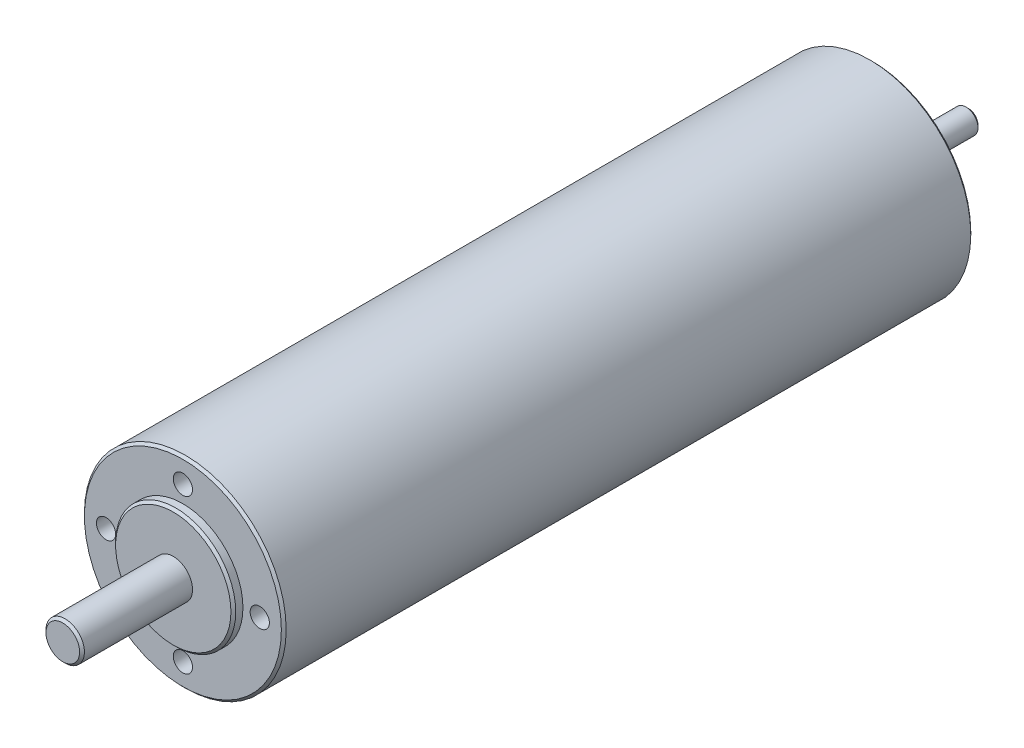
ISO-10303-21;
HEADER;
FILE_DESCRIPTION(('STEP AP214'),'2;1');
FILE_NAME('part.step','',(''),(''),'','','');
FILE_SCHEMA(('AUTOMOTIVE_DESIGN { 1 0 10303 214 1 1 1 1 }'));
ENDSEC;
DATA;
#1=APPLICATION_CONTEXT('core data for automotive mechanical design processes');
#2=APPLICATION_PROTOCOL_DEFINITION('international standard','automotive_design',2000,#1);
#3=PRODUCT_CONTEXT('',#1,'mechanical');
#4=PRODUCT('Part','Part','',(#3));
#5=PRODUCT_RELATED_PRODUCT_CATEGORY('part','',(#4));
#6=PRODUCT_DEFINITION_FORMATION('','',#4);
#7=PRODUCT_DEFINITION_CONTEXT('part definition',#1,'design');
#8=PRODUCT_DEFINITION('design','',#6,#7);
#9=PRODUCT_DEFINITION_SHAPE('','',#8);
#10=(LENGTH_UNIT() NAMED_UNIT(*) SI_UNIT(.MILLI.,.METRE.));
#11=(NAMED_UNIT(*) PLANE_ANGLE_UNIT() SI_UNIT($,.RADIAN.));
#12=(NAMED_UNIT(*) SI_UNIT($,.STERADIAN.) SOLID_ANGLE_UNIT());
#13=UNCERTAINTY_MEASURE_WITH_UNIT(LENGTH_MEASURE(1.E-05),#10,'distance_accuracy_value','');
#14=(GEOMETRIC_REPRESENTATION_CONTEXT(3) GLOBAL_UNCERTAINTY_ASSIGNED_CONTEXT((#13)) GLOBAL_UNIT_ASSIGNED_CONTEXT((#10,
#11,#12)) REPRESENTATION_CONTEXT('',''));
#15=CARTESIAN_POINT('',(0.,0.,0.));
#16=DIRECTION('',(0.,0.,1.));
#17=DIRECTION('',(1.,0.,0.));
#18=AXIS2_PLACEMENT_3D('',#15,#16,#17);
#19=CARTESIAN_POINT('',(0.,0.,-145.5));
#20=DIRECTION('',(0.,0.,-1.));
#21=DIRECTION('',(-1.,0.,0.));
#22=AXIS2_PLACEMENT_3D('',#19,#20,#21);
#23=PLANE('',#22);
#24=CARTESIAN_POINT('',(0.,0.,-145.5));
#25=DIRECTION('',(0.,0.,-1.));
#26=DIRECTION('',(-1.,0.,0.));
#27=AXIS2_PLACEMENT_3D('',#24,#25,#26);
#28=CIRCLE('',#27,10.5);
#29=CARTESIAN_POINT('',(-10.5,0.,-145.5));
#30=VERTEX_POINT('',#29);
#31=EDGE_CURVE('E49',#30,#30,#28,.T.);
#32=ORIENTED_EDGE('',*,*,#31,.T.);
#33=EDGE_LOOP('',(#32));
#34=FACE_BOUND('',#33,.T.);
#35=CARTESIAN_POINT('',(0.,0.,-145.5));
#36=DIRECTION('',(0.,0.,-1.));
#37=DIRECTION('',(-1.,0.,0.));
#38=AXIS2_PLACEMENT_3D('',#35,#36,#37);
#39=CIRCLE('',#38,2.5);
#40=CARTESIAN_POINT('',(-2.5,0.,-145.5));
#41=VERTEX_POINT('',#40);
#42=EDGE_CURVE('E87',#41,#41,#39,.T.);
#43=ORIENTED_EDGE('',*,*,#42,.F.);
#44=EDGE_LOOP('',(#43));
#45=FACE_BOUND('',#44,.T.);
#46=ADVANCED_FACE('F34',(#34,#45),#23,.T.);
#47=CARTESIAN_POINT('',(0.,0.,-143.5));
#48=DIRECTION('',(0.,0.,1.));
#49=DIRECTION('',(1.,0.,0.));
#50=AXIS2_PLACEMENT_3D('',#47,#48,#49);
#51=PLANE('',#50);
#52=CARTESIAN_POINT('',(0.,0.,-143.5));
#53=DIRECTION('',(0.,0.,1.));
#54=DIRECTION('',(1.,0.,0.));
#55=AXIS2_PLACEMENT_3D('',#52,#53,#54);
#56=CIRCLE('',#55,20.5);
#57=CARTESIAN_POINT('',(20.5,0.,-143.5));
#58=VERTEX_POINT('',#57);
#59=EDGE_CURVE('E54',#58,#58,#56,.F.);
#60=ORIENTED_EDGE('',*,*,#59,.T.);
#61=EDGE_LOOP('',(#60));
#62=FACE_BOUND('',#61,.T.);
#63=CARTESIAN_POINT('',(0.,0.,-143.5));
#64=DIRECTION('',(0.,0.,1.));
#65=DIRECTION('',(1.,0.,0.));
#66=AXIS2_PLACEMENT_3D('',#63,#64,#65);
#67=CIRCLE('',#66,11.);
#68=CARTESIAN_POINT('',(11.,0.,-143.5));
#69=VERTEX_POINT('',#68);
#70=EDGE_CURVE('E78',#69,#69,#67,.F.);
#71=ORIENTED_EDGE('',*,*,#70,.F.);
#72=EDGE_LOOP('',(#71));
#73=FACE_BOUND('',#72,.T.);
#74=ADVANCED_FACE('F154',(#62,#73),#51,.F.);
#75=CARTESIAN_POINT('',(0.,0.,2.));
#76=DIRECTION('',(0.,0.,1.));
#77=DIRECTION('',(1.,0.,0.));
#78=AXIS2_PLACEMENT_3D('',#75,#76,#77);
#79=PLANE('',#78);
#80=CARTESIAN_POINT('',(0.,0.,2.));
#81=DIRECTION('',(0.,0.,1.));
#82=DIRECTION('',(1.,0.,0.));
#83=AXIS2_PLACEMENT_3D('',#80,#81,#82);
#84=CIRCLE('',#83,12.);
#85=CARTESIAN_POINT('',(12.,0.,2.));
#86=VERTEX_POINT('',#85);
#87=EDGE_CURVE('E69',#86,#86,#84,.T.);
#88=ORIENTED_EDGE('',*,*,#87,.T.);
#89=EDGE_LOOP('',(#88));
#90=FACE_BOUND('',#89,.T.);
#91=CARTESIAN_POINT('',(0.,0.,2.));
#92=DIRECTION('',(0.,0.,1.));
#93=DIRECTION('',(1.,0.,0.));
#94=AXIS2_PLACEMENT_3D('',#91,#92,#93);
#95=CIRCLE('',#94,4.);
#96=CARTESIAN_POINT('',(4.,0.,2.));
#97=VERTEX_POINT('',#96);
#98=EDGE_CURVE('E84',#97,#97,#95,.T.);
#99=ORIENTED_EDGE('',*,*,#98,.F.);
#100=EDGE_LOOP('',(#99));
#101=FACE_BOUND('',#100,.T.);
#102=ADVANCED_FACE('F127',(#90,#101),#79,.T.);
#103=CARTESIAN_POINT('',(0.,0.,0.));
#104=DIRECTION('',(0.,0.,1.));
#105=DIRECTION('',(1.,0.,0.));
#106=AXIS2_PLACEMENT_3D('',#103,#104,#105);
#107=PLANE('',#106);
#108=CARTESIAN_POINT('',(-16.,0.,0.));
#109=DIRECTION('',(0.,0.,1.));
#110=DIRECTION('',(1.,0.,0.));
#111=AXIS2_PLACEMENT_3D('',#108,#109,#110);
#112=CIRCLE('',#111,2.);
#113=CARTESIAN_POINT('',(-14.,0.,0.));
#114=VERTEX_POINT('',#113);
#115=EDGE_CURVE('E109',#114,#114,#112,.T.);
#116=ORIENTED_EDGE('',*,*,#115,.F.);
#117=EDGE_LOOP('',(#116));
#118=FACE_BOUND('',#117,.T.);
#119=CARTESIAN_POINT('',(0.,-16.,0.));
#120=DIRECTION('',(0.,0.,1.));
#121=DIRECTION('',(1.,0.,0.));
#122=AXIS2_PLACEMENT_3D('',#119,#120,#121);
#123=CIRCLE('',#122,2.);
#124=CARTESIAN_POINT('',(2.,-16.,0.));
#125=VERTEX_POINT('',#124);
#126=EDGE_CURVE('E103',#125,#125,#123,.T.);
#127=ORIENTED_EDGE('',*,*,#126,.F.);
#128=EDGE_LOOP('',(#127));
#129=FACE_BOUND('',#128,.T.);
#130=CARTESIAN_POINT('',(16.,0.,0.));
#131=DIRECTION('',(0.,0.,1.));
#132=DIRECTION('',(1.,0.,0.));
#133=AXIS2_PLACEMENT_3D('',#130,#131,#132);
#134=CIRCLE('',#133,2.);
#135=CARTESIAN_POINT('',(18.,0.,0.));
#136=VERTEX_POINT('',#135);
#137=EDGE_CURVE('E97',#136,#136,#134,.T.);
#138=ORIENTED_EDGE('',*,*,#137,.F.);
#139=EDGE_LOOP('',(#138));
#140=FACE_BOUND('',#139,.T.);
#141=CARTESIAN_POINT('',(0.,16.,0.));
#142=DIRECTION('',(0.,0.,1.));
#143=DIRECTION('',(1.,0.,0.));
#144=AXIS2_PLACEMENT_3D('',#141,#142,#143);
#145=CIRCLE('',#144,2.);
#146=CARTESIAN_POINT('',(2.,16.,0.));
#147=VERTEX_POINT('',#146);
#148=EDGE_CURVE('E91',#147,#147,#145,.T.);
#149=ORIENTED_EDGE('',*,*,#148,.F.);
#150=EDGE_LOOP('',(#149));
#151=FACE_BOUND('',#150,.T.);
#152=CARTESIAN_POINT('',(0.,0.,0.));
#153=DIRECTION('',(0.,0.,1.));
#154=DIRECTION('',(1.,0.,0.));
#155=AXIS2_PLACEMENT_3D('',#152,#153,#154);
#156=CIRCLE('',#155,20.5);
#157=CARTESIAN_POINT('',(20.5,0.,0.));
#158=VERTEX_POINT('',#157);
#159=EDGE_CURVE('E63',#158,#158,#156,.T.);
#160=ORIENTED_EDGE('',*,*,#159,.T.);
#161=EDGE_LOOP('',(#160));
#162=FACE_BOUND('',#161,.T.);
#163=CARTESIAN_POINT('',(0.,0.,0.));
#164=DIRECTION('',(0.,0.,1.));
#165=DIRECTION('',(1.,0.,0.));
#166=AXIS2_PLACEMENT_3D('',#163,#164,#165);
#167=CIRCLE('',#166,12.5);
#168=CARTESIAN_POINT('',(12.5,0.,0.));
#169=VERTEX_POINT('',#168);
#170=EDGE_CURVE('E81',#169,#169,#167,.T.);
#171=ORIENTED_EDGE('',*,*,#170,.F.);
#172=EDGE_LOOP('',(#171));
#173=FACE_BOUND('',#172,.T.);
#174=ADVANCED_FACE('F124',(#118,#129,#140,#151,#162,#173),#107,.T.);
#175=CARTESIAN_POINT('',(0.,0.,-143.5));
#176=DIRECTION('',(0.,0.,1.));
#177=DIRECTION('',(1.,0.,0.));
#178=AXIS2_PLACEMENT_3D('',#175,#176,#177);
#179=CYLINDRICAL_SURFACE('',#178,21.);
#180=CARTESIAN_POINT('',(0.,0.,-0.5));
#181=DIRECTION('',(0.,0.,1.));
#182=DIRECTION('',(1.,0.,0.));
#183=AXIS2_PLACEMENT_3D('',#180,#181,#182);
#184=CIRCLE('',#183,21.);
#185=CARTESIAN_POINT('',(21.,0.,-0.5));
#186=VERTEX_POINT('',#185);
#187=EDGE_CURVE('E57',#186,#186,#184,.F.);
#188=ORIENTED_EDGE('',*,*,#187,.T.);
#189=EDGE_LOOP('',(#188));
#190=FACE_BOUND('',#189,.T.);
#191=CARTESIAN_POINT('',(0.,0.,-143.));
#192=DIRECTION('',(0.,0.,1.));
#193=DIRECTION('',(1.,0.,0.));
#194=AXIS2_PLACEMENT_3D('',#191,#192,#193);
#195=CIRCLE('',#194,21.);
#196=CARTESIAN_POINT('',(21.,0.,-143.));
#197=VERTEX_POINT('',#196);
#198=EDGE_CURVE('E60',#197,#197,#195,.T.);
#199=ORIENTED_EDGE('',*,*,#198,.T.);
#200=EDGE_LOOP('',(#199));
#201=FACE_BOUND('',#200,.T.);
#202=ADVANCED_FACE('F36',(#190,#201),#179,.T.);
#203=CARTESIAN_POINT('',(0.,0.,2.));
#204=DIRECTION('',(0.,0.,-1.));
#205=DIRECTION('',(-1.,0.,0.));
#206=AXIS2_PLACEMENT_3D('',#203,#204,#205);
#207=CYLINDRICAL_SURFACE('',#206,12.5);
#208=CARTESIAN_POINT('',(0.,0.,1.5));
#209=DIRECTION('',(0.,0.,1.));
#210=DIRECTION('',(1.,0.,0.));
#211=AXIS2_PLACEMENT_3D('',#208,#209,#210);
#212=CIRCLE('',#211,12.5);
#213=CARTESIAN_POINT('',(12.5,0.,1.5));
#214=VERTEX_POINT('',#213);
#215=EDGE_CURVE('E66',#214,#214,#212,.F.);
#216=ORIENTED_EDGE('',*,*,#215,.T.);
#217=EDGE_LOOP('',(#216));
#218=FACE_BOUND('',#217,.T.);
#219=ORIENTED_EDGE('',*,*,#170,.T.);
#220=EDGE_LOOP('',(#219));
#221=FACE_BOUND('',#220,.T.);
#222=ADVANCED_FACE('F139',(#218,#221),#207,.T.);
#223=CARTESIAN_POINT('',(0.,0.,25.));
#224=DIRECTION('',(0.,0.,-1.));
#225=DIRECTION('',(-1.,0.,0.));
#226=AXIS2_PLACEMENT_3D('',#223,#224,#225);
#227=CYLINDRICAL_SURFACE('',#226,4.);
#228=CARTESIAN_POINT('',(0.,0.,24.5));
#229=DIRECTION('',(0.,0.,1.));
#230=DIRECTION('',(1.,0.,0.));
#231=AXIS2_PLACEMENT_3D('',#228,#229,#230);
#232=CIRCLE('',#231,4.);
#233=CARTESIAN_POINT('',(4.,0.,24.5));
#234=VERTEX_POINT('',#233);
#235=EDGE_CURVE('E72',#234,#234,#232,.F.);
#236=ORIENTED_EDGE('',*,*,#235,.T.);
#237=EDGE_LOOP('',(#236));
#238=FACE_BOUND('',#237,.T.);
#239=ORIENTED_EDGE('',*,*,#98,.T.);
#240=EDGE_LOOP('',(#239));
#241=FACE_BOUND('',#240,.T.);
#242=ADVANCED_FACE('F141',(#238,#241),#227,.T.);
#243=CARTESIAN_POINT('',(0.,0.,25.));
#244=DIRECTION('',(0.,0.,1.));
#245=DIRECTION('',(1.,0.,0.));
#246=AXIS2_PLACEMENT_3D('',#243,#244,#245);
#247=PLANE('',#246);
#248=CARTESIAN_POINT('',(0.,0.,25.));
#249=DIRECTION('',(0.,0.,1.));
#250=DIRECTION('',(1.,0.,0.));
#251=AXIS2_PLACEMENT_3D('',#248,#249,#250);
#252=CIRCLE('',#251,3.5);
#253=CARTESIAN_POINT('',(3.5,0.,25.));
#254=VERTEX_POINT('',#253);
#255=EDGE_CURVE('E75',#254,#254,#252,.T.);
#256=ORIENTED_EDGE('',*,*,#255,.T.);
#257=EDGE_LOOP('',(#256));
#258=FACE_BOUND('',#257,.T.);
#259=ADVANCED_FACE('F148',(#258),#247,.T.);
#260=CARTESIAN_POINT('',(0.,0.,-145.5));
#261=DIRECTION('',(0.,0.,1.));
#262=DIRECTION('',(1.,0.,0.));
#263=AXIS2_PLACEMENT_3D('',#260,#261,#262);
#264=CYLINDRICAL_SURFACE('',#263,11.);
#265=CARTESIAN_POINT('',(0.,0.,-145.));
#266=DIRECTION('',(0.,0.,-1.));
#267=DIRECTION('',(-1.,0.,0.));
#268=AXIS2_PLACEMENT_3D('',#265,#266,#267);
#269=CIRCLE('',#268,11.);
#270=CARTESIAN_POINT('',(-11.,0.,-145.));
#271=VERTEX_POINT('',#270);
#272=EDGE_CURVE('E45',#271,#271,#269,.F.);
#273=ORIENTED_EDGE('',*,*,#272,.T.);
#274=EDGE_LOOP('',(#273));
#275=FACE_BOUND('',#274,.T.);
#276=ORIENTED_EDGE('',*,*,#70,.T.);
#277=EDGE_LOOP('',(#276));
#278=FACE_BOUND('',#277,.T.);
#279=ADVANCED_FACE('F166',(#275,#278),#264,.T.);
#280=CARTESIAN_POINT('',(0.,0.,-163.5));
#281=DIRECTION('',(0.,0.,1.));
#282=DIRECTION('',(1.,0.,0.));
#283=AXIS2_PLACEMENT_3D('',#280,#281,#282);
#284=CYLINDRICAL_SURFACE('',#283,2.5);
#285=CARTESIAN_POINT('',(0.,0.,-163.));
#286=DIRECTION('',(0.,0.,-1.));
#287=DIRECTION('',(-1.,0.,0.));
#288=AXIS2_PLACEMENT_3D('',#285,#286,#287);
#289=CIRCLE('',#288,2.5);
#290=CARTESIAN_POINT('',(-2.5,0.,-163.));
#291=VERTEX_POINT('',#290);
#292=EDGE_CURVE('E10',#291,#291,#289,.F.);
#293=ORIENTED_EDGE('',*,*,#292,.T.);
#294=EDGE_LOOP('',(#293));
#295=FACE_BOUND('',#294,.T.);
#296=ORIENTED_EDGE('',*,*,#42,.T.);
#297=EDGE_LOOP('',(#296));
#298=FACE_BOUND('',#297,.T.);
#299=ADVANCED_FACE('F164',(#295,#298),#284,.T.);
#300=CARTESIAN_POINT('',(0.,0.,-163.5));
#301=DIRECTION('',(0.,0.,-1.));
#302=DIRECTION('',(-1.,0.,0.));
#303=AXIS2_PLACEMENT_3D('',#300,#301,#302);
#304=PLANE('',#303);
#305=CARTESIAN_POINT('',(0.,0.,-163.5));
#306=DIRECTION('',(0.,0.,-1.));
#307=DIRECTION('',(-1.,0.,0.));
#308=AXIS2_PLACEMENT_3D('',#305,#306,#307);
#309=CIRCLE('',#308,2.);
#310=CARTESIAN_POINT('',(-2.,0.,-163.5));
#311=VERTEX_POINT('',#310);
#312=EDGE_CURVE('E41',#311,#311,#309,.T.);
#313=ORIENTED_EDGE('',*,*,#312,.T.);
#314=EDGE_LOOP('',(#313));
#315=FACE_BOUND('',#314,.T.);
#316=ADVANCED_FACE('F194',(#315),#304,.T.);
#317=CARTESIAN_POINT('',(0.,0.,25.));
#318=DIRECTION('',(0.,0.,-1.));
#319=DIRECTION('',(-1.,0.,0.));
#320=AXIS2_PLACEMENT_3D('',#317,#318,#319);
#321=CONICAL_SURFACE('',#320,3.5,0.785398163397444);
#322=ORIENTED_EDGE('',*,*,#235,.F.);
#323=EDGE_LOOP('',(#322));
#324=FACE_BOUND('',#323,.T.);
#325=ORIENTED_EDGE('',*,*,#255,.F.);
#326=EDGE_LOOP('',(#325));
#327=FACE_BOUND('',#326,.T.);
#328=ADVANCED_FACE('F184',(#324,#327),#321,.T.);
#329=CARTESIAN_POINT('',(0.,0.,2.));
#330=DIRECTION('',(0.,0.,-1.));
#331=DIRECTION('',(-1.,0.,0.));
#332=AXIS2_PLACEMENT_3D('',#329,#330,#331);
#333=CONICAL_SURFACE('',#332,12.,0.785398163397447);
#334=ORIENTED_EDGE('',*,*,#215,.F.);
#335=EDGE_LOOP('',(#334));
#336=FACE_BOUND('',#335,.T.);
#337=ORIENTED_EDGE('',*,*,#87,.F.);
#338=EDGE_LOOP('',(#337));
#339=FACE_BOUND('',#338,.T.);
#340=ADVANCED_FACE('F181',(#336,#339),#333,.T.);
#341=CARTESIAN_POINT('',(0.,0.,0.));
#342=DIRECTION('',(0.,0.,-1.));
#343=DIRECTION('',(-1.,0.,0.));
#344=AXIS2_PLACEMENT_3D('',#341,#342,#343);
#345=CONICAL_SURFACE('',#344,20.5,0.785398163397452);
#346=ORIENTED_EDGE('',*,*,#187,.F.);
#347=EDGE_LOOP('',(#346));
#348=FACE_BOUND('',#347,.T.);
#349=ORIENTED_EDGE('',*,*,#159,.F.);
#350=EDGE_LOOP('',(#349));
#351=FACE_BOUND('',#350,.T.);
#352=ADVANCED_FACE('F183',(#348,#351),#345,.T.);
#353=CARTESIAN_POINT('',(0.,0.,-143.));
#354=DIRECTION('',(0.,0.,1.));
#355=DIRECTION('',(1.,0.,0.));
#356=AXIS2_PLACEMENT_3D('',#353,#354,#355);
#357=CONICAL_SURFACE('',#356,21.,0.785398163397445);
#358=ORIENTED_EDGE('',*,*,#59,.F.);
#359=EDGE_LOOP('',(#358));
#360=FACE_BOUND('',#359,.T.);
#361=ORIENTED_EDGE('',*,*,#198,.F.);
#362=EDGE_LOOP('',(#361));
#363=FACE_BOUND('',#362,.T.);
#364=ADVANCED_FACE('F191',(#360,#363),#357,.T.);
#365=CARTESIAN_POINT('',(0.,0.,-145.5));
#366=DIRECTION('',(0.,0.,1.));
#367=DIRECTION('',(1.,0.,0.));
#368=AXIS2_PLACEMENT_3D('',#365,#366,#367);
#369=CONICAL_SURFACE('',#368,10.5,0.785398163397447);
#370=ORIENTED_EDGE('',*,*,#272,.F.);
#371=EDGE_LOOP('',(#370));
#372=FACE_BOUND('',#371,.T.);
#373=ORIENTED_EDGE('',*,*,#31,.F.);
#374=EDGE_LOOP('',(#373));
#375=FACE_BOUND('',#374,.T.);
#376=ADVANCED_FACE('F274',(#372,#375),#369,.T.);
#377=CARTESIAN_POINT('',(0.,0.,-163.5));
#378=DIRECTION('',(0.,0.,1.));
#379=DIRECTION('',(1.,0.,0.));
#380=AXIS2_PLACEMENT_3D('',#377,#378,#379);
#381=CONICAL_SURFACE('',#380,2.,0.785398163397448);
#382=ORIENTED_EDGE('',*,*,#292,.F.);
#383=EDGE_LOOP('',(#382));
#384=FACE_BOUND('',#383,.T.);
#385=ORIENTED_EDGE('',*,*,#312,.F.);
#386=EDGE_LOOP('',(#385));
#387=FACE_BOUND('',#386,.T.);
#388=ADVANCED_FACE('F282',(#384,#387),#381,.T.);
#389=CARTESIAN_POINT('',(0.,16.,-10.));
#390=DIRECTION('',(0.,0.,1.));
#391=DIRECTION('',(1.,0.,0.));
#392=AXIS2_PLACEMENT_3D('',#389,#390,#391);
#393=CYLINDRICAL_SURFACE('',#392,2.);
#394=CARTESIAN_POINT('',(0.,16.,-10.));
#395=DIRECTION('',(0.,0.,1.));
#396=DIRECTION('',(1.,0.,0.));
#397=AXIS2_PLACEMENT_3D('',#394,#395,#396);
#398=CIRCLE('',#397,2.);
#399=CARTESIAN_POINT('',(2.,16.,-10.));
#400=VERTEX_POINT('',#399);
#401=EDGE_CURVE('E90',#400,#400,#398,.T.);
#402=ORIENTED_EDGE('',*,*,#401,.F.);
#403=EDGE_LOOP('',(#402));
#404=FACE_BOUND('',#403,.T.);
#405=ORIENTED_EDGE('',*,*,#148,.T.);
#406=EDGE_LOOP('',(#405));
#407=FACE_BOUND('',#406,.T.);
#408=ADVANCED_FACE('F291',(#404,#407),#393,.F.);
#409=CARTESIAN_POINT('',(0.,16.,-10.));
#410=DIRECTION('',(0.,0.,1.));
#411=DIRECTION('',(1.,0.,0.));
#412=AXIS2_PLACEMENT_3D('',#409,#410,#411);
#413=PLANE('',#412);
#414=ORIENTED_EDGE('',*,*,#401,.T.);
#415=EDGE_LOOP('',(#414));
#416=FACE_BOUND('',#415,.T.);
#417=ADVANCED_FACE('F302',(#416),#413,.T.);
#418=CARTESIAN_POINT('',(16.,0.,-10.));
#419=DIRECTION('',(0.,0.,1.));
#420=DIRECTION('',(1.,0.,0.));
#421=AXIS2_PLACEMENT_3D('',#418,#419,#420);
#422=CYLINDRICAL_SURFACE('',#421,2.);
#423=CARTESIAN_POINT('',(16.,0.,-10.));
#424=DIRECTION('',(0.,0.,1.));
#425=DIRECTION('',(1.,0.,0.));
#426=AXIS2_PLACEMENT_3D('',#423,#424,#425);
#427=CIRCLE('',#426,2.);
#428=CARTESIAN_POINT('',(18.,0.,-10.));
#429=VERTEX_POINT('',#428);
#430=EDGE_CURVE('E94',#429,#429,#427,.T.);
#431=ORIENTED_EDGE('',*,*,#430,.F.);
#432=EDGE_LOOP('',(#431));
#433=FACE_BOUND('',#432,.T.);
#434=ORIENTED_EDGE('',*,*,#137,.T.);
#435=EDGE_LOOP('',(#434));
#436=FACE_BOUND('',#435,.T.);
#437=ADVANCED_FACE('F311',(#433,#436),#422,.F.);
#438=CARTESIAN_POINT('',(16.,0.,-10.));
#439=DIRECTION('',(0.,0.,1.));
#440=DIRECTION('',(1.,0.,0.));
#441=AXIS2_PLACEMENT_3D('',#438,#439,#440);
#442=PLANE('',#441);
#443=ORIENTED_EDGE('',*,*,#430,.T.);
#444=EDGE_LOOP('',(#443));
#445=FACE_BOUND('',#444,.T.);
#446=ADVANCED_FACE('F320',(#445),#442,.T.);
#447=CARTESIAN_POINT('',(0.,-16.,-10.));
#448=DIRECTION('',(0.,0.,1.));
#449=DIRECTION('',(1.,0.,0.));
#450=AXIS2_PLACEMENT_3D('',#447,#448,#449);
#451=CYLINDRICAL_SURFACE('',#450,2.);
#452=CARTESIAN_POINT('',(0.,-16.,-10.));
#453=DIRECTION('',(0.,0.,1.));
#454=DIRECTION('',(1.,0.,0.));
#455=AXIS2_PLACEMENT_3D('',#452,#453,#454);
#456=CIRCLE('',#455,2.);
#457=CARTESIAN_POINT('',(2.,-16.,-10.));
#458=VERTEX_POINT('',#457);
#459=EDGE_CURVE('E100',#458,#458,#456,.T.);
#460=ORIENTED_EDGE('',*,*,#459,.F.);
#461=EDGE_LOOP('',(#460));
#462=FACE_BOUND('',#461,.T.);
#463=ORIENTED_EDGE('',*,*,#126,.T.);
#464=EDGE_LOOP('',(#463));
#465=FACE_BOUND('',#464,.T.);
#466=ADVANCED_FACE('F329',(#462,#465),#451,.F.);
#467=CARTESIAN_POINT('',(0.,-16.,-10.));
#468=DIRECTION('',(0.,0.,1.));
#469=DIRECTION('',(1.,0.,0.));
#470=AXIS2_PLACEMENT_3D('',#467,#468,#469);
#471=PLANE('',#470);
#472=ORIENTED_EDGE('',*,*,#459,.T.);
#473=EDGE_LOOP('',(#472));
#474=FACE_BOUND('',#473,.T.);
#475=ADVANCED_FACE('F120',(#474),#471,.T.);
#476=CARTESIAN_POINT('',(-16.,0.,-10.));
#477=DIRECTION('',(0.,0.,1.));
#478=DIRECTION('',(1.,0.,0.));
#479=AXIS2_PLACEMENT_3D('',#476,#477,#478);
#480=CYLINDRICAL_SURFACE('',#479,2.);
#481=CARTESIAN_POINT('',(-16.,0.,-10.));
#482=DIRECTION('',(0.,0.,1.));
#483=DIRECTION('',(1.,0.,0.));
#484=AXIS2_PLACEMENT_3D('',#481,#482,#483);
#485=CIRCLE('',#484,2.);
#486=CARTESIAN_POINT('',(-14.,0.,-10.));
#487=VERTEX_POINT('',#486);
#488=EDGE_CURVE('E106',#487,#487,#485,.T.);
#489=ORIENTED_EDGE('',*,*,#488,.F.);
#490=EDGE_LOOP('',(#489));
#491=FACE_BOUND('',#490,.T.);
#492=ORIENTED_EDGE('',*,*,#115,.T.);
#493=EDGE_LOOP('',(#492));
#494=FACE_BOUND('',#493,.T.);
#495=ADVANCED_FACE('F117',(#491,#494),#480,.F.);
#496=CARTESIAN_POINT('',(-16.,0.,-10.));
#497=DIRECTION('',(0.,0.,1.));
#498=DIRECTION('',(1.,0.,0.));
#499=AXIS2_PLACEMENT_3D('',#496,#497,#498);
#500=PLANE('',#499);
#501=ORIENTED_EDGE('',*,*,#488,.T.);
#502=EDGE_LOOP('',(#501));
#503=FACE_BOUND('',#502,.T.);
#504=ADVANCED_FACE('F115',(#503),#500,.T.);
#505=CLOSED_SHELL('',(#46,#74,#102,#174,#202,#222,#242,#259,#279,#299,#316,#328,#340,#352,#364,
#376,#388,#408,#417,#437,#446,#466,#475,#495,#504));
#506=MANIFOLD_SOLID_BREP('B2',#505);
#507=ADVANCED_BREP_SHAPE_REPRESENTATION('',(#18,#506),#14);
#508=SHAPE_DEFINITION_REPRESENTATION(#9,#507);
ENDSEC;
END-ISO-10303-21;
